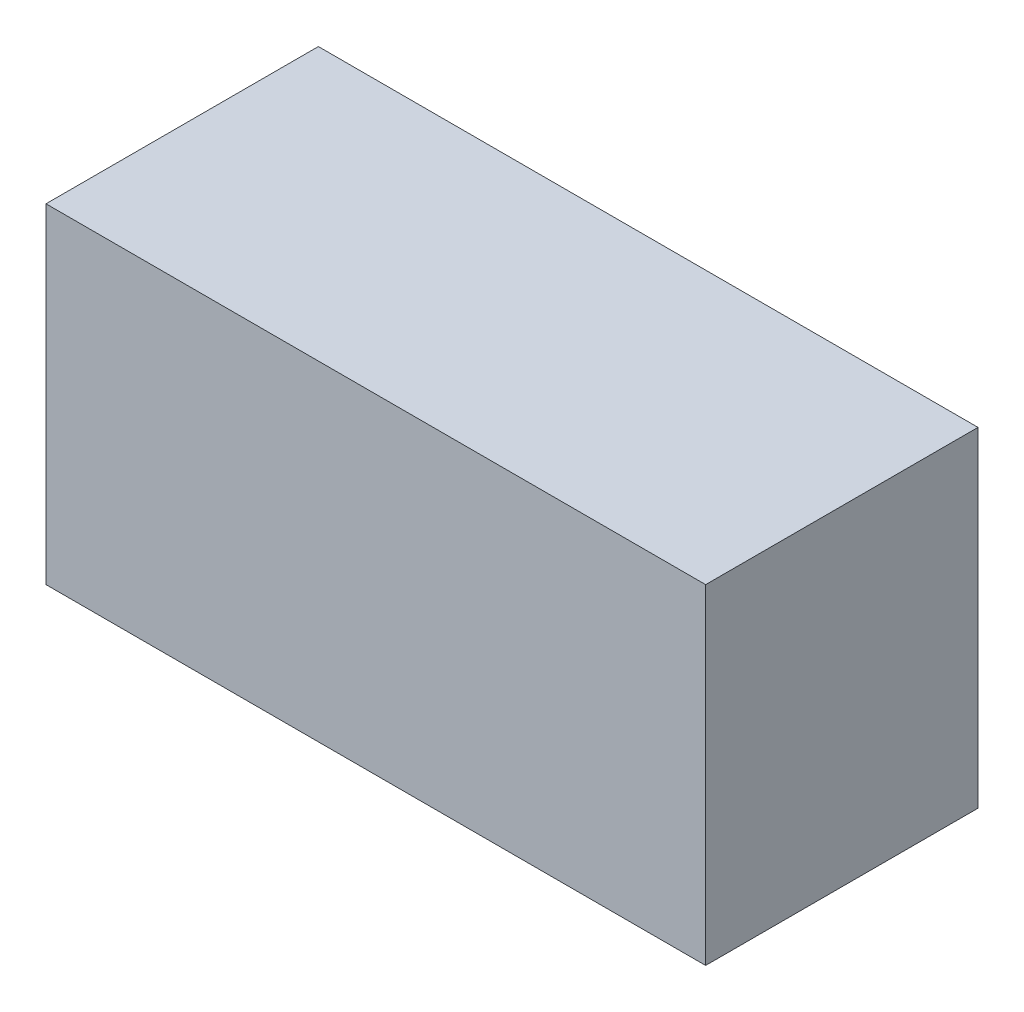
ISO-10303-21;
HEADER;
FILE_DESCRIPTION(('STEP AP214'),'2;1');
FILE_NAME('part.step','',(''),(''),'','','');
FILE_SCHEMA(('AUTOMOTIVE_DESIGN { 1 0 10303 214 1 1 1 1 }'));
ENDSEC;
DATA;
#1=APPLICATION_CONTEXT('core data for automotive mechanical design processes');
#2=APPLICATION_PROTOCOL_DEFINITION('international standard','automotive_design',2000,#1);
#3=PRODUCT_CONTEXT('',#1,'mechanical');
#4=PRODUCT('Part','Part','',(#3));
#5=PRODUCT_RELATED_PRODUCT_CATEGORY('part','',(#4));
#6=PRODUCT_DEFINITION_FORMATION('','',#4);
#7=PRODUCT_DEFINITION_CONTEXT('part definition',#1,'design');
#8=PRODUCT_DEFINITION('design','',#6,#7);
#9=PRODUCT_DEFINITION_SHAPE('','',#8);
#10=(LENGTH_UNIT() NAMED_UNIT(*) SI_UNIT(.MILLI.,.METRE.));
#11=(NAMED_UNIT(*) PLANE_ANGLE_UNIT() SI_UNIT($,.RADIAN.));
#12=(NAMED_UNIT(*) SI_UNIT($,.STERADIAN.) SOLID_ANGLE_UNIT());
#13=UNCERTAINTY_MEASURE_WITH_UNIT(LENGTH_MEASURE(1.E-05),#10,'distance_accuracy_value','');
#14=(GEOMETRIC_REPRESENTATION_CONTEXT(3) GLOBAL_UNCERTAINTY_ASSIGNED_CONTEXT((#13)) GLOBAL_UNIT_ASSIGNED_CONTEXT((#10,
#11,#12)) REPRESENTATION_CONTEXT('',''));
#15=CARTESIAN_POINT('',(0.,0.,0.));
#16=DIRECTION('',(0.,0.,1.));
#17=DIRECTION('',(1.,0.,0.));
#18=AXIS2_PLACEMENT_3D('',#15,#16,#17);
#19=CARTESIAN_POINT('',(-1.016,0.508,0.8390001));
#20=DIRECTION('',(0.,0.,-1.));
#21=DIRECTION('',(-1.,0.,0.));
#22=AXIS2_PLACEMENT_3D('',#19,#20,#21);
#23=PLANE('',#22);
#24=DIRECTION('',(1.,0.,0.));
#25=VECTOR('',#24,1.);
#26=CARTESIAN_POINT('',(-1.016,-0.508,0.8390001));
#27=LINE('',#26,#25);
#28=CARTESIAN_POINT('',(-1.016,-0.508,0.8390001));
#29=VERTEX_POINT('',#28);
#30=CARTESIAN_POINT('',(1.016,-0.508,0.8390001));
#31=VERTEX_POINT('',#30);
#32=EDGE_CURVE('E55',#29,#31,#27,.T.);
#33=ORIENTED_EDGE('',*,*,#32,.T.);
#34=DIRECTION('',(0.,1.,0.));
#35=VECTOR('',#34,1.);
#36=CARTESIAN_POINT('',(1.016,-0.508,0.8390001));
#37=LINE('',#36,#35);
#38=CARTESIAN_POINT('',(1.016,0.508,0.8390001));
#39=VERTEX_POINT('',#38);
#40=EDGE_CURVE('E58',#31,#39,#37,.T.);
#41=ORIENTED_EDGE('',*,*,#40,.T.);
#42=DIRECTION('',(1.,0.,0.));
#43=VECTOR('',#42,1.);
#44=CARTESIAN_POINT('',(1.016,0.508,0.8390001));
#45=LINE('',#44,#43);
#46=CARTESIAN_POINT('',(-1.016,0.508,0.8390001));
#47=VERTEX_POINT('',#46);
#48=EDGE_CURVE('E60',#39,#47,#45,.F.);
#49=ORIENTED_EDGE('',*,*,#48,.T.);
#50=DIRECTION('',(0.,1.,0.));
#51=VECTOR('',#50,1.);
#52=CARTESIAN_POINT('',(-1.016,0.508,0.8390001));
#53=LINE('',#52,#51);
#54=EDGE_CURVE('E20',#29,#47,#53,.T.);
#55=ORIENTED_EDGE('',*,*,#54,.F.);
#56=EDGE_LOOP('',(#33,#41,#49,#55));
#57=FACE_BOUND('',#56,.T.);
#58=ADVANCED_FACE('F17',(#57),#23,.F.);
#59=CARTESIAN_POINT('',(1.016,0.508,0.));
#60=DIRECTION('',(0.,-1.,0.));
#61=DIRECTION('',(0.,0.,-1.));
#62=AXIS2_PLACEMENT_3D('',#59,#60,#61);
#63=PLANE('',#62);
#64=DIRECTION('',(0.,0.,-1.));
#65=VECTOR('',#64,1.);
#66=CARTESIAN_POINT('',(-1.016,0.508,0.));
#67=LINE('',#66,#65);
#68=CARTESIAN_POINT('',(-1.016,0.508,0.));
#69=VERTEX_POINT('',#68);
#70=EDGE_CURVE('E71',#69,#47,#67,.F.);
#71=ORIENTED_EDGE('',*,*,#70,.T.);
#72=ORIENTED_EDGE('',*,*,#48,.F.);
#73=DIRECTION('',(0.,0.,1.));
#74=VECTOR('',#73,1.);
#75=CARTESIAN_POINT('',(1.016,0.508,0.));
#76=LINE('',#75,#74);
#77=CARTESIAN_POINT('',(1.016,0.508,0.));
#78=VERTEX_POINT('',#77);
#79=EDGE_CURVE('E65',#39,#78,#76,.F.);
#80=ORIENTED_EDGE('',*,*,#79,.T.);
#81=DIRECTION('',(-1.,0.,0.));
#82=VECTOR('',#81,1.);
#83=CARTESIAN_POINT('',(-1.016,0.508,0.));
#84=LINE('',#83,#82);
#85=EDGE_CURVE('E83',#69,#78,#84,.F.);
#86=ORIENTED_EDGE('',*,*,#85,.F.);
#87=EDGE_LOOP('',(#71,#72,#80,#86));
#88=FACE_BOUND('',#87,.T.);
#89=ADVANCED_FACE('F68',(#88),#63,.F.);
#90=CARTESIAN_POINT('',(1.016,-0.508,0.));
#91=DIRECTION('',(-1.,0.,0.));
#92=DIRECTION('',(0.,0.,1.));
#93=AXIS2_PLACEMENT_3D('',#90,#91,#92);
#94=PLANE('',#93);
#95=ORIENTED_EDGE('',*,*,#79,.F.);
#96=ORIENTED_EDGE('',*,*,#40,.F.);
#97=DIRECTION('',(0.,0.,1.));
#98=VECTOR('',#97,1.);
#99=CARTESIAN_POINT('',(1.016,-0.508,0.));
#100=LINE('',#99,#98);
#101=CARTESIAN_POINT('',(1.016,-0.508,0.));
#102=VERTEX_POINT('',#101);
#103=EDGE_CURVE('E77',#31,#102,#100,.F.);
#104=ORIENTED_EDGE('',*,*,#103,.T.);
#105=DIRECTION('',(0.,1.,0.));
#106=VECTOR('',#105,1.);
#107=CARTESIAN_POINT('',(1.016,0.508,0.));
#108=LINE('',#107,#106);
#109=EDGE_CURVE('E74',#78,#102,#108,.F.);
#110=ORIENTED_EDGE('',*,*,#109,.F.);
#111=EDGE_LOOP('',(#95,#96,#104,#110));
#112=FACE_BOUND('',#111,.T.);
#113=ADVANCED_FACE('F72',(#112),#94,.F.);
#114=CARTESIAN_POINT('',(-1.016,-0.508,0.));
#115=DIRECTION('',(0.,1.,0.));
#116=DIRECTION('',(0.,0.,1.));
#117=AXIS2_PLACEMENT_3D('',#114,#115,#116);
#118=PLANE('',#117);
#119=ORIENTED_EDGE('',*,*,#103,.F.);
#120=ORIENTED_EDGE('',*,*,#32,.F.);
#121=DIRECTION('',(0.,0.,-1.));
#122=VECTOR('',#121,1.);
#123=CARTESIAN_POINT('',(-1.016,-0.508,0.));
#124=LINE('',#123,#122);
#125=CARTESIAN_POINT('',(-1.016,-0.508,0.));
#126=VERTEX_POINT('',#125);
#127=EDGE_CURVE('E35',#29,#126,#124,.T.);
#128=ORIENTED_EDGE('',*,*,#127,.T.);
#129=DIRECTION('',(-1.,0.,0.));
#130=VECTOR('',#129,1.);
#131=CARTESIAN_POINT('',(-1.016,-0.508,0.));
#132=LINE('',#131,#130);
#133=EDGE_CURVE('E26',#102,#126,#132,.T.);
#134=ORIENTED_EDGE('',*,*,#133,.F.);
#135=EDGE_LOOP('',(#119,#120,#128,#134));
#136=FACE_BOUND('',#135,.T.);
#137=ADVANCED_FACE('F89',(#136),#118,.F.);
#138=CARTESIAN_POINT('',(-1.016,0.508,0.));
#139=DIRECTION('',(1.,0.,0.));
#140=DIRECTION('',(0.,0.,-1.));
#141=AXIS2_PLACEMENT_3D('',#138,#139,#140);
#142=PLANE('',#141);
#143=ORIENTED_EDGE('',*,*,#127,.F.);
#144=ORIENTED_EDGE('',*,*,#54,.T.);
#145=ORIENTED_EDGE('',*,*,#70,.F.);
#146=DIRECTION('',(0.,1.,0.));
#147=VECTOR('',#146,1.);
#148=CARTESIAN_POINT('',(-1.016,0.508,0.));
#149=LINE('',#148,#147);
#150=EDGE_CURVE('E11',#126,#69,#149,.T.);
#151=ORIENTED_EDGE('',*,*,#150,.F.);
#152=EDGE_LOOP('',(#143,#144,#145,#151));
#153=FACE_BOUND('',#152,.T.);
#154=ADVANCED_FACE('F91',(#153),#142,.F.);
#155=CARTESIAN_POINT('',(-1.016,0.508,0.));
#156=DIRECTION('',(0.,0.,-1.));
#157=DIRECTION('',(-1.,0.,0.));
#158=AXIS2_PLACEMENT_3D('',#155,#156,#157);
#159=PLANE('',#158);
#160=ORIENTED_EDGE('',*,*,#133,.T.);
#161=ORIENTED_EDGE('',*,*,#150,.T.);
#162=ORIENTED_EDGE('',*,*,#85,.T.);
#163=ORIENTED_EDGE('',*,*,#109,.T.);
#164=EDGE_LOOP('',(#160,#161,#162,#163));
#165=FACE_BOUND('',#164,.T.);
#166=ADVANCED_FACE('F88',(#165),#159,.T.);
#167=CLOSED_SHELL('',(#58,#89,#113,#137,#154,#166));
#168=MANIFOLD_SOLID_BREP('B1',#167);
#169=ADVANCED_BREP_SHAPE_REPRESENTATION('',(#18,#168),#14);
#170=SHAPE_DEFINITION_REPRESENTATION(#9,#169);
ENDSEC;
END-ISO-10303-21;
